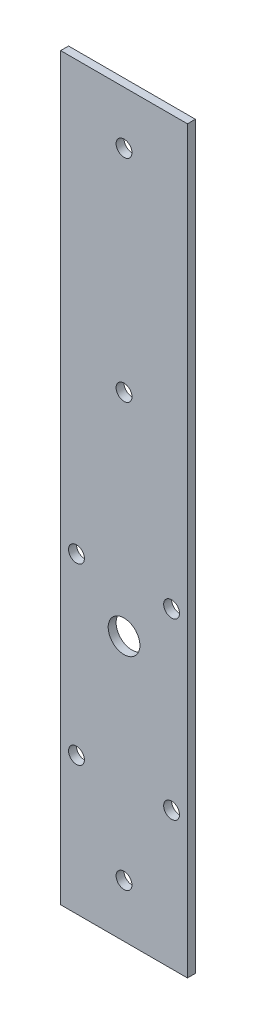
ISO-10303-21;
HEADER;
FILE_DESCRIPTION(('STEP AP214'),'2;1');
FILE_NAME('part.step','',(''),(''),'','','');
FILE_SCHEMA(('AUTOMOTIVE_DESIGN { 1 0 10303 214 1 1 1 1 }'));
ENDSEC;
DATA;
#1=APPLICATION_CONTEXT('core data for automotive mechanical design processes');
#2=APPLICATION_PROTOCOL_DEFINITION('international standard','automotive_design',2000,#1);
#3=PRODUCT_CONTEXT('',#1,'mechanical');
#4=PRODUCT('Part','Part','',(#3));
#5=PRODUCT_RELATED_PRODUCT_CATEGORY('part','',(#4));
#6=PRODUCT_DEFINITION_FORMATION('','',#4);
#7=PRODUCT_DEFINITION_CONTEXT('part definition',#1,'design');
#8=PRODUCT_DEFINITION('design','',#6,#7);
#9=PRODUCT_DEFINITION_SHAPE('','',#8);
#10=(LENGTH_UNIT() NAMED_UNIT(*) SI_UNIT(.MILLI.,.METRE.));
#11=(NAMED_UNIT(*) PLANE_ANGLE_UNIT() SI_UNIT($,.RADIAN.));
#12=(NAMED_UNIT(*) SI_UNIT($,.STERADIAN.) SOLID_ANGLE_UNIT());
#13=UNCERTAINTY_MEASURE_WITH_UNIT(LENGTH_MEASURE(1.E-05),#10,'distance_accuracy_value','');
#14=(GEOMETRIC_REPRESENTATION_CONTEXT(3) GLOBAL_UNCERTAINTY_ASSIGNED_CONTEXT((#13)) GLOBAL_UNIT_ASSIGNED_CONTEXT((#10,
#11,#12)) REPRESENTATION_CONTEXT('',''));
#15=CARTESIAN_POINT('',(0.,0.,0.));
#16=DIRECTION('',(0.,0.,1.));
#17=DIRECTION('',(1.,0.,0.));
#18=AXIS2_PLACEMENT_3D('',#15,#16,#17);
#19=CARTESIAN_POINT('',(0.,0.,1.5));
#20=DIRECTION('',(0.,0.,-1.));
#21=DIRECTION('',(-1.,0.,0.));
#22=AXIS2_PLACEMENT_3D('',#19,#20,#21);
#23=PLANE('',#22);
#24=DIRECTION('',(0.,-1.,0.));
#25=VECTOR('',#24,1.);
#26=CARTESIAN_POINT('',(-12.,70.,1.5));
#27=LINE('',#26,#25);
#28=CARTESIAN_POINT('',(-12.,70.,1.5));
#29=VERTEX_POINT('',#28);
#30=CARTESIAN_POINT('',(-12.,-70.,1.5));
#31=VERTEX_POINT('',#30);
#32=EDGE_CURVE('E84',#29,#31,#27,.T.);
#33=ORIENTED_EDGE('',*,*,#32,.T.);
#34=DIRECTION('',(1.,0.,0.));
#35=VECTOR('',#34,1.);
#36=CARTESIAN_POINT('',(12.,-70.,1.5));
#37=LINE('',#36,#35);
#38=CARTESIAN_POINT('',(12.,-70.,1.5));
#39=VERTEX_POINT('',#38);
#40=EDGE_CURVE('E79',#31,#39,#37,.T.);
#41=ORIENTED_EDGE('',*,*,#40,.T.);
#42=DIRECTION('',(0.,1.,0.));
#43=VECTOR('',#42,1.);
#44=CARTESIAN_POINT('',(12.,70.,1.5));
#45=LINE('',#44,#43);
#46=CARTESIAN_POINT('',(12.,70.,1.5));
#47=VERTEX_POINT('',#46);
#48=EDGE_CURVE('E82',#39,#47,#45,.T.);
#49=ORIENTED_EDGE('',*,*,#48,.T.);
#50=DIRECTION('',(-1.,0.,0.));
#51=VECTOR('',#50,1.);
#52=CARTESIAN_POINT('',(12.,70.,1.5));
#53=LINE('',#52,#51);
#54=EDGE_CURVE('E49',#47,#29,#53,.T.);
#55=ORIENTED_EDGE('',*,*,#54,.T.);
#56=EDGE_LOOP('',(#33,#41,#49,#55));
#57=FACE_BOUND('',#56,.T.);
#58=CARTESIAN_POINT('',(0.,20.,1.5));
#59=DIRECTION('',(0.,0.,1.));
#60=DIRECTION('',(1.,0.,0.));
#61=AXIS2_PLACEMENT_3D('',#58,#59,#60);
#62=CIRCLE('',#61,1.5);
#63=CARTESIAN_POINT('',(1.5,20.,1.5));
#64=VERTEX_POINT('',#63);
#65=EDGE_CURVE('E99',#64,#64,#62,.T.);
#66=ORIENTED_EDGE('',*,*,#65,.F.);
#67=EDGE_LOOP('',(#66));
#68=FACE_BOUND('',#67,.T.);
#69=CARTESIAN_POINT('',(0.,-20.,1.5));
#70=DIRECTION('',(0.,0.,1.));
#71=DIRECTION('',(1.,0.,0.));
#72=AXIS2_PLACEMENT_3D('',#69,#70,#71);
#73=CIRCLE('',#72,3.);
#74=CARTESIAN_POINT('',(3.,-20.,1.5));
#75=VERTEX_POINT('',#74);
#76=EDGE_CURVE('E114',#75,#75,#73,.T.);
#77=ORIENTED_EDGE('',*,*,#76,.F.);
#78=EDGE_LOOP('',(#77));
#79=FACE_BOUND('',#78,.T.);
#80=CARTESIAN_POINT('',(0.,-60.,1.5));
#81=DIRECTION('',(0.,0.,1.));
#82=DIRECTION('',(1.,0.,0.));
#83=AXIS2_PLACEMENT_3D('',#80,#81,#82);
#84=CIRCLE('',#83,1.5);
#85=CARTESIAN_POINT('',(1.5,-60.,1.5));
#86=VERTEX_POINT('',#85);
#87=EDGE_CURVE('E120',#86,#86,#84,.T.);
#88=ORIENTED_EDGE('',*,*,#87,.F.);
#89=EDGE_LOOP('',(#88));
#90=FACE_BOUND('',#89,.T.);
#91=CARTESIAN_POINT('',(0.,60.,1.5));
#92=DIRECTION('',(0.,0.,1.));
#93=DIRECTION('',(-1.,0.,0.));
#94=AXIS2_PLACEMENT_3D('',#91,#92,#93);
#95=CIRCLE('',#94,1.5);
#96=CARTESIAN_POINT('',(-1.5,60.,1.5));
#97=VERTEX_POINT('',#96);
#98=EDGE_CURVE('E126',#97,#97,#95,.T.);
#99=ORIENTED_EDGE('',*,*,#98,.F.);
#100=EDGE_LOOP('',(#99));
#101=FACE_BOUND('',#100,.T.);
#102=CARTESIAN_POINT('',(8.99999999999999,-11.,1.5));
#103=DIRECTION('',(0.,0.,1.));
#104=DIRECTION('',(1.,0.,0.));
#105=AXIS2_PLACEMENT_3D('',#102,#103,#104);
#106=CIRCLE('',#105,1.5);
#107=CARTESIAN_POINT('',(10.5,-11.,1.5));
#108=VERTEX_POINT('',#107);
#109=EDGE_CURVE('E132',#108,#108,#106,.T.);
#110=ORIENTED_EDGE('',*,*,#109,.F.);
#111=EDGE_LOOP('',(#110));
#112=FACE_BOUND('',#111,.T.);
#113=CARTESIAN_POINT('',(-9.00000000000001,-11.,1.5));
#114=DIRECTION('',(0.,0.,1.));
#115=DIRECTION('',(1.,0.,0.));
#116=AXIS2_PLACEMENT_3D('',#113,#114,#115);
#117=CIRCLE('',#116,1.5);
#118=CARTESIAN_POINT('',(-7.50000000000001,-11.,1.5));
#119=VERTEX_POINT('',#118);
#120=EDGE_CURVE('E138',#119,#119,#117,.T.);
#121=ORIENTED_EDGE('',*,*,#120,.F.);
#122=EDGE_LOOP('',(#121));
#123=FACE_BOUND('',#122,.T.);
#124=CARTESIAN_POINT('',(8.99999999999999,-44.,1.5));
#125=DIRECTION('',(0.,0.,1.));
#126=DIRECTION('',(1.,0.,0.));
#127=AXIS2_PLACEMENT_3D('',#124,#125,#126);
#128=CIRCLE('',#127,1.5);
#129=CARTESIAN_POINT('',(10.5,-44.,1.5));
#130=VERTEX_POINT('',#129);
#131=EDGE_CURVE('E144',#130,#130,#128,.T.);
#132=ORIENTED_EDGE('',*,*,#131,.F.);
#133=EDGE_LOOP('',(#132));
#134=FACE_BOUND('',#133,.T.);
#135=CARTESIAN_POINT('',(-9.00000000000001,-44.,1.5));
#136=DIRECTION('',(0.,0.,1.));
#137=DIRECTION('',(1.,0.,0.));
#138=AXIS2_PLACEMENT_3D('',#135,#136,#137);
#139=CIRCLE('',#138,1.5);
#140=CARTESIAN_POINT('',(-7.50000000000001,-44.,1.5));
#141=VERTEX_POINT('',#140);
#142=EDGE_CURVE('E150',#141,#141,#139,.T.);
#143=ORIENTED_EDGE('',*,*,#142,.F.);
#144=EDGE_LOOP('',(#143));
#145=FACE_BOUND('',#144,.T.);
#146=ADVANCED_FACE('F32',(#57,#68,#79,#90,#101,#112,#123,#134,#145),#23,.F.);
#147=CARTESIAN_POINT('',(0.,0.,0.));
#148=DIRECTION('',(0.,0.,-1.));
#149=DIRECTION('',(-1.,0.,0.));
#150=AXIS2_PLACEMENT_3D('',#147,#148,#149);
#151=PLANE('',#150);
#152=CARTESIAN_POINT('',(8.99999999999999,-44.,0.));
#153=DIRECTION('',(0.,0.,1.));
#154=DIRECTION('',(1.,0.,0.));
#155=AXIS2_PLACEMENT_3D('',#152,#153,#154);
#156=CIRCLE('',#155,1.5);
#157=CARTESIAN_POINT('',(10.5,-44.,0.));
#158=VERTEX_POINT('',#157);
#159=EDGE_CURVE('E147',#158,#158,#156,.T.);
#160=ORIENTED_EDGE('',*,*,#159,.T.);
#161=EDGE_LOOP('',(#160));
#162=FACE_BOUND('',#161,.T.);
#163=CARTESIAN_POINT('',(8.99999999999999,-11.,0.));
#164=DIRECTION('',(0.,0.,1.));
#165=DIRECTION('',(1.,0.,0.));
#166=AXIS2_PLACEMENT_3D('',#163,#164,#165);
#167=CIRCLE('',#166,1.5);
#168=CARTESIAN_POINT('',(10.5,-11.,0.));
#169=VERTEX_POINT('',#168);
#170=EDGE_CURVE('E135',#169,#169,#167,.T.);
#171=ORIENTED_EDGE('',*,*,#170,.T.);
#172=EDGE_LOOP('',(#171));
#173=FACE_BOUND('',#172,.T.);
#174=CARTESIAN_POINT('',(0.,-60.,0.));
#175=DIRECTION('',(0.,0.,1.));
#176=DIRECTION('',(1.,0.,0.));
#177=AXIS2_PLACEMENT_3D('',#174,#175,#176);
#178=CIRCLE('',#177,1.5);
#179=CARTESIAN_POINT('',(1.5,-60.,0.));
#180=VERTEX_POINT('',#179);
#181=EDGE_CURVE('E123',#180,#180,#178,.T.);
#182=ORIENTED_EDGE('',*,*,#181,.T.);
#183=EDGE_LOOP('',(#182));
#184=FACE_BOUND('',#183,.T.);
#185=CARTESIAN_POINT('',(0.,20.,0.));
#186=DIRECTION('',(0.,0.,1.));
#187=DIRECTION('',(1.,0.,0.));
#188=AXIS2_PLACEMENT_3D('',#185,#186,#187);
#189=CIRCLE('',#188,1.5);
#190=CARTESIAN_POINT('',(1.5,20.,0.));
#191=VERTEX_POINT('',#190);
#192=EDGE_CURVE('E111',#191,#191,#189,.T.);
#193=ORIENTED_EDGE('',*,*,#192,.T.);
#194=EDGE_LOOP('',(#193));
#195=FACE_BOUND('',#194,.T.);
#196=DIRECTION('',(0.,-1.,0.));
#197=VECTOR('',#196,1.);
#198=CARTESIAN_POINT('',(-12.,70.,0.));
#199=LINE('',#198,#197);
#200=CARTESIAN_POINT('',(-12.,70.,0.));
#201=VERTEX_POINT('',#200);
#202=CARTESIAN_POINT('',(-12.,-70.,0.));
#203=VERTEX_POINT('',#202);
#204=EDGE_CURVE('E96',#201,#203,#199,.T.);
#205=ORIENTED_EDGE('',*,*,#204,.F.);
#206=DIRECTION('',(-1.,0.,0.));
#207=VECTOR('',#206,1.);
#208=CARTESIAN_POINT('',(12.,70.,0.));
#209=LINE('',#208,#207);
#210=CARTESIAN_POINT('',(12.,70.,0.));
#211=VERTEX_POINT('',#210);
#212=EDGE_CURVE('E72',#211,#201,#209,.T.);
#213=ORIENTED_EDGE('',*,*,#212,.F.);
#214=DIRECTION('',(0.,1.,0.));
#215=VECTOR('',#214,1.);
#216=CARTESIAN_POINT('',(12.,70.,0.));
#217=LINE('',#216,#215);
#218=CARTESIAN_POINT('',(12.,-70.,0.));
#219=VERTEX_POINT('',#218);
#220=EDGE_CURVE('E66',#219,#211,#217,.T.);
#221=ORIENTED_EDGE('',*,*,#220,.F.);
#222=DIRECTION('',(1.,0.,0.));
#223=VECTOR('',#222,1.);
#224=CARTESIAN_POINT('',(12.,-70.,0.));
#225=LINE('',#224,#223);
#226=EDGE_CURVE('E88',#203,#219,#225,.T.);
#227=ORIENTED_EDGE('',*,*,#226,.F.);
#228=EDGE_LOOP('',(#205,#213,#221,#227));
#229=FACE_BOUND('',#228,.T.);
#230=CARTESIAN_POINT('',(0.,-20.,0.));
#231=DIRECTION('',(0.,0.,1.));
#232=DIRECTION('',(1.,0.,0.));
#233=AXIS2_PLACEMENT_3D('',#230,#231,#232);
#234=CIRCLE('',#233,3.);
#235=CARTESIAN_POINT('',(3.,-20.,0.));
#236=VERTEX_POINT('',#235);
#237=EDGE_CURVE('E117',#236,#236,#234,.T.);
#238=ORIENTED_EDGE('',*,*,#237,.T.);
#239=EDGE_LOOP('',(#238));
#240=FACE_BOUND('',#239,.T.);
#241=CARTESIAN_POINT('',(0.,60.,0.));
#242=DIRECTION('',(0.,0.,1.));
#243=DIRECTION('',(-1.,0.,0.));
#244=AXIS2_PLACEMENT_3D('',#241,#242,#243);
#245=CIRCLE('',#244,1.5);
#246=CARTESIAN_POINT('',(-1.5,60.,0.));
#247=VERTEX_POINT('',#246);
#248=EDGE_CURVE('E129',#247,#247,#245,.T.);
#249=ORIENTED_EDGE('',*,*,#248,.T.);
#250=EDGE_LOOP('',(#249));
#251=FACE_BOUND('',#250,.T.);
#252=CARTESIAN_POINT('',(-9.00000000000001,-11.,0.));
#253=DIRECTION('',(0.,0.,1.));
#254=DIRECTION('',(1.,0.,0.));
#255=AXIS2_PLACEMENT_3D('',#252,#253,#254);
#256=CIRCLE('',#255,1.5);
#257=CARTESIAN_POINT('',(-7.50000000000001,-11.,0.));
#258=VERTEX_POINT('',#257);
#259=EDGE_CURVE('E141',#258,#258,#256,.T.);
#260=ORIENTED_EDGE('',*,*,#259,.T.);
#261=EDGE_LOOP('',(#260));
#262=FACE_BOUND('',#261,.T.);
#263=CARTESIAN_POINT('',(-9.00000000000001,-44.,0.));
#264=DIRECTION('',(0.,0.,1.));
#265=DIRECTION('',(1.,0.,0.));
#266=AXIS2_PLACEMENT_3D('',#263,#264,#265);
#267=CIRCLE('',#266,1.5);
#268=CARTESIAN_POINT('',(-7.50000000000001,-44.,0.));
#269=VERTEX_POINT('',#268);
#270=EDGE_CURVE('E153',#269,#269,#267,.T.);
#271=ORIENTED_EDGE('',*,*,#270,.T.);
#272=EDGE_LOOP('',(#271));
#273=FACE_BOUND('',#272,.T.);
#274=ADVANCED_FACE('F107',(#162,#173,#184,#195,#229,#240,#251,#262,#273),#151,.T.);
#275=CARTESIAN_POINT('',(-12.,70.,1.5));
#276=DIRECTION('',(1.,0.,0.));
#277=DIRECTION('',(0.,0.,-1.));
#278=AXIS2_PLACEMENT_3D('',#275,#276,#277);
#279=PLANE('',#278);
#280=ORIENTED_EDGE('',*,*,#204,.T.);
#281=DIRECTION('',(0.,0.,-1.));
#282=VECTOR('',#281,1.);
#283=CARTESIAN_POINT('',(-12.,-70.,1.5));
#284=LINE('',#283,#282);
#285=EDGE_CURVE('E11',#31,#203,#284,.T.);
#286=ORIENTED_EDGE('',*,*,#285,.F.);
#287=ORIENTED_EDGE('',*,*,#32,.F.);
#288=DIRECTION('',(0.,0.,-1.));
#289=VECTOR('',#288,1.);
#290=CARTESIAN_POINT('',(-12.,70.,1.5));
#291=LINE('',#290,#289);
#292=EDGE_CURVE('E92',#29,#201,#291,.T.);
#293=ORIENTED_EDGE('',*,*,#292,.T.);
#294=EDGE_LOOP('',(#280,#286,#287,#293));
#295=FACE_BOUND('',#294,.T.);
#296=ADVANCED_FACE('F34',(#295),#279,.F.);
#297=CARTESIAN_POINT('',(12.,-70.,1.5));
#298=DIRECTION('',(0.,1.,0.));
#299=DIRECTION('',(0.,0.,1.));
#300=AXIS2_PLACEMENT_3D('',#297,#298,#299);
#301=PLANE('',#300);
#302=ORIENTED_EDGE('',*,*,#226,.T.);
#303=DIRECTION('',(0.,0.,-1.));
#304=VECTOR('',#303,1.);
#305=CARTESIAN_POINT('',(12.,-70.,1.5));
#306=LINE('',#305,#304);
#307=EDGE_CURVE('E41',#39,#219,#306,.T.);
#308=ORIENTED_EDGE('',*,*,#307,.F.);
#309=ORIENTED_EDGE('',*,*,#40,.F.);
#310=ORIENTED_EDGE('',*,*,#285,.T.);
#311=EDGE_LOOP('',(#302,#308,#309,#310));
#312=FACE_BOUND('',#311,.T.);
#313=ADVANCED_FACE('F87',(#312),#301,.F.);
#314=CARTESIAN_POINT('',(12.,70.,1.5));
#315=DIRECTION('',(-1.,0.,0.));
#316=DIRECTION('',(0.,0.,1.));
#317=AXIS2_PLACEMENT_3D('',#314,#315,#316);
#318=PLANE('',#317);
#319=ORIENTED_EDGE('',*,*,#220,.T.);
#320=DIRECTION('',(0.,0.,-1.));
#321=VECTOR('',#320,1.);
#322=CARTESIAN_POINT('',(12.,70.,1.5));
#323=LINE('',#322,#321);
#324=EDGE_CURVE('E89',#47,#211,#323,.T.);
#325=ORIENTED_EDGE('',*,*,#324,.F.);
#326=ORIENTED_EDGE('',*,*,#48,.F.);
#327=ORIENTED_EDGE('',*,*,#307,.T.);
#328=EDGE_LOOP('',(#319,#325,#326,#327));
#329=FACE_BOUND('',#328,.T.);
#330=ADVANCED_FACE('F90',(#329),#318,.F.);
#331=CARTESIAN_POINT('',(12.,70.,1.5));
#332=DIRECTION('',(0.,-1.,0.));
#333=DIRECTION('',(0.,0.,-1.));
#334=AXIS2_PLACEMENT_3D('',#331,#332,#333);
#335=PLANE('',#334);
#336=ORIENTED_EDGE('',*,*,#212,.T.);
#337=ORIENTED_EDGE('',*,*,#292,.F.);
#338=ORIENTED_EDGE('',*,*,#54,.F.);
#339=ORIENTED_EDGE('',*,*,#324,.T.);
#340=EDGE_LOOP('',(#336,#337,#338,#339));
#341=FACE_BOUND('',#340,.T.);
#342=ADVANCED_FACE('F104',(#341),#335,.F.);
#343=CARTESIAN_POINT('',(0.,20.,1.5));
#344=DIRECTION('',(0.,0.,-1.));
#345=DIRECTION('',(-1.,0.,0.));
#346=AXIS2_PLACEMENT_3D('',#343,#344,#345);
#347=CYLINDRICAL_SURFACE('',#346,1.5);
#348=ORIENTED_EDGE('',*,*,#65,.T.);
#349=EDGE_LOOP('',(#348));
#350=FACE_BOUND('',#349,.T.);
#351=ORIENTED_EDGE('',*,*,#192,.F.);
#352=EDGE_LOOP('',(#351));
#353=FACE_BOUND('',#352,.T.);
#354=ADVANCED_FACE('F170',(#350,#353),#347,.F.);
#355=CARTESIAN_POINT('',(0.,-20.,1.5));
#356=DIRECTION('',(0.,0.,-1.));
#357=DIRECTION('',(-1.,0.,0.));
#358=AXIS2_PLACEMENT_3D('',#355,#356,#357);
#359=CYLINDRICAL_SURFACE('',#358,3.);
#360=ORIENTED_EDGE('',*,*,#76,.T.);
#361=EDGE_LOOP('',(#360));
#362=FACE_BOUND('',#361,.T.);
#363=ORIENTED_EDGE('',*,*,#237,.F.);
#364=EDGE_LOOP('',(#363));
#365=FACE_BOUND('',#364,.T.);
#366=ADVANCED_FACE('F216',(#362,#365),#359,.F.);
#367=CARTESIAN_POINT('',(0.,-60.,1.5));
#368=DIRECTION('',(0.,0.,-1.));
#369=DIRECTION('',(-1.,0.,0.));
#370=AXIS2_PLACEMENT_3D('',#367,#368,#369);
#371=CYLINDRICAL_SURFACE('',#370,1.5);
#372=ORIENTED_EDGE('',*,*,#87,.T.);
#373=EDGE_LOOP('',(#372));
#374=FACE_BOUND('',#373,.T.);
#375=ORIENTED_EDGE('',*,*,#181,.F.);
#376=EDGE_LOOP('',(#375));
#377=FACE_BOUND('',#376,.T.);
#378=ADVANCED_FACE('F224',(#374,#377),#371,.F.);
#379=CARTESIAN_POINT('',(0.,60.,1.5));
#380=DIRECTION('',(0.,0.,-1.));
#381=DIRECTION('',(-1.,0.,0.));
#382=AXIS2_PLACEMENT_3D('',#379,#380,#381);
#383=CYLINDRICAL_SURFACE('',#382,1.5);
#384=ORIENTED_EDGE('',*,*,#98,.T.);
#385=EDGE_LOOP('',(#384));
#386=FACE_BOUND('',#385,.T.);
#387=ORIENTED_EDGE('',*,*,#248,.F.);
#388=EDGE_LOOP('',(#387));
#389=FACE_BOUND('',#388,.T.);
#390=ADVANCED_FACE('F232',(#386,#389),#383,.F.);
#391=CARTESIAN_POINT('',(8.99999999999999,-11.,1.5));
#392=DIRECTION('',(0.,0.,-1.));
#393=DIRECTION('',(-1.,0.,0.));
#394=AXIS2_PLACEMENT_3D('',#391,#392,#393);
#395=CYLINDRICAL_SURFACE('',#394,1.5);
#396=ORIENTED_EDGE('',*,*,#109,.T.);
#397=EDGE_LOOP('',(#396));
#398=FACE_BOUND('',#397,.T.);
#399=ORIENTED_EDGE('',*,*,#170,.F.);
#400=EDGE_LOOP('',(#399));
#401=FACE_BOUND('',#400,.T.);
#402=ADVANCED_FACE('F241',(#398,#401),#395,.F.);
#403=CARTESIAN_POINT('',(-9.00000000000001,-11.,1.5));
#404=DIRECTION('',(0.,0.,-1.));
#405=DIRECTION('',(-1.,0.,0.));
#406=AXIS2_PLACEMENT_3D('',#403,#404,#405);
#407=CYLINDRICAL_SURFACE('',#406,1.5);
#408=ORIENTED_EDGE('',*,*,#120,.T.);
#409=EDGE_LOOP('',(#408));
#410=FACE_BOUND('',#409,.T.);
#411=ORIENTED_EDGE('',*,*,#259,.F.);
#412=EDGE_LOOP('',(#411));
#413=FACE_BOUND('',#412,.T.);
#414=ADVANCED_FACE('F250',(#410,#413),#407,.F.);
#415=CARTESIAN_POINT('',(8.99999999999999,-44.,1.5));
#416=DIRECTION('',(0.,0.,-1.));
#417=DIRECTION('',(-1.,0.,0.));
#418=AXIS2_PLACEMENT_3D('',#415,#416,#417);
#419=CYLINDRICAL_SURFACE('',#418,1.5);
#420=ORIENTED_EDGE('',*,*,#131,.T.);
#421=EDGE_LOOP('',(#420));
#422=FACE_BOUND('',#421,.T.);
#423=ORIENTED_EDGE('',*,*,#159,.F.);
#424=EDGE_LOOP('',(#423));
#425=FACE_BOUND('',#424,.T.);
#426=ADVANCED_FACE('F259',(#422,#425),#419,.F.);
#427=CARTESIAN_POINT('',(-9.00000000000001,-44.,1.5));
#428=DIRECTION('',(0.,0.,-1.));
#429=DIRECTION('',(-1.,0.,0.));
#430=AXIS2_PLACEMENT_3D('',#427,#428,#429);
#431=CYLINDRICAL_SURFACE('',#430,1.5);
#432=ORIENTED_EDGE('',*,*,#142,.T.);
#433=EDGE_LOOP('',(#432));
#434=FACE_BOUND('',#433,.T.);
#435=ORIENTED_EDGE('',*,*,#270,.F.);
#436=EDGE_LOOP('',(#435));
#437=FACE_BOUND('',#436,.T.);
#438=ADVANCED_FACE('F159',(#434,#437),#431,.F.);
#439=CLOSED_SHELL('',(#146,#274,#296,#313,#330,#342,#354,#366,#378,#390,#402,#414,#426,#438));
#440=MANIFOLD_SOLID_BREP('B2',#439);
#441=ADVANCED_BREP_SHAPE_REPRESENTATION('',(#18,#440),#14);
#442=SHAPE_DEFINITION_REPRESENTATION(#9,#441);
ENDSEC;
END-ISO-10303-21;
